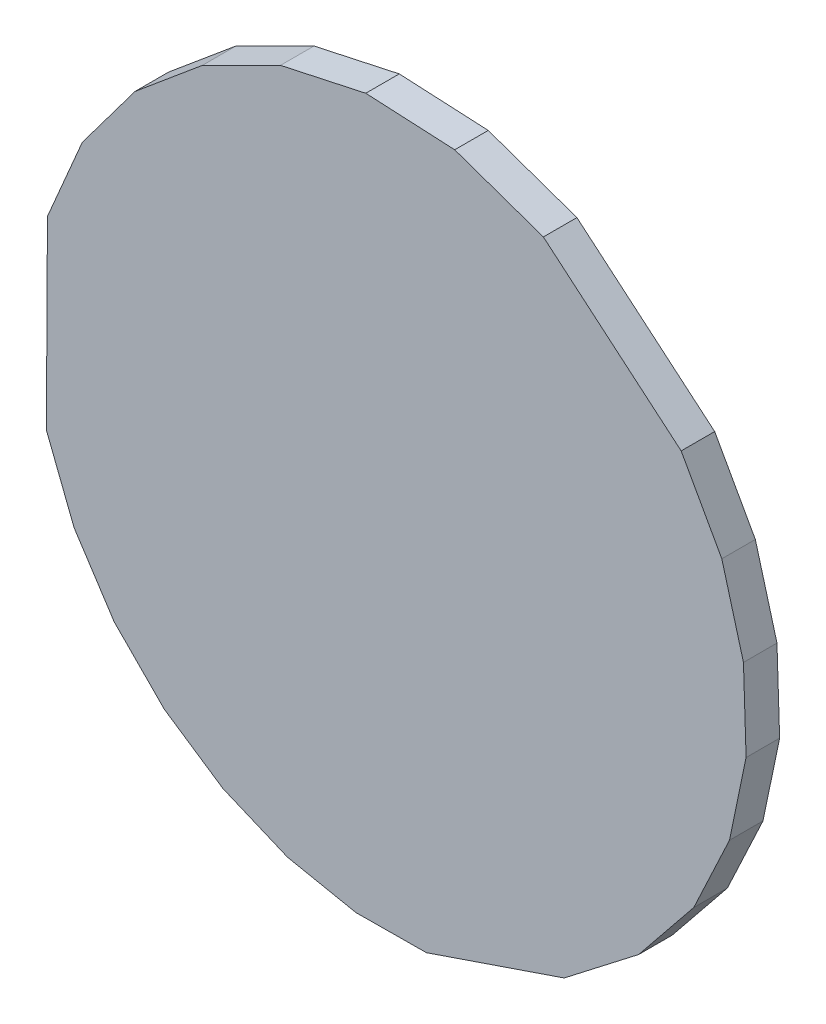
ISO-10303-21;
HEADER;
FILE_DESCRIPTION(('STEP AP214'),'2;1');
FILE_NAME('part.step','',(''),(''),'','','');
FILE_SCHEMA(('AUTOMOTIVE_DESIGN { 1 0 10303 214 1 1 1 1 }'));
ENDSEC;
DATA;
#1=APPLICATION_CONTEXT('core data for automotive mechanical design processes');
#2=APPLICATION_PROTOCOL_DEFINITION('international standard','automotive_design',2000,#1);
#3=PRODUCT_CONTEXT('',#1,'mechanical');
#4=PRODUCT('Part','Part','',(#3));
#5=PRODUCT_RELATED_PRODUCT_CATEGORY('part','',(#4));
#6=PRODUCT_DEFINITION_FORMATION('','',#4);
#7=PRODUCT_DEFINITION_CONTEXT('part definition',#1,'design');
#8=PRODUCT_DEFINITION('design','',#6,#7);
#9=PRODUCT_DEFINITION_SHAPE('','',#8);
#10=(LENGTH_UNIT() NAMED_UNIT(*) SI_UNIT(.MILLI.,.METRE.));
#11=(NAMED_UNIT(*) PLANE_ANGLE_UNIT() SI_UNIT($,.RADIAN.));
#12=(NAMED_UNIT(*) SI_UNIT($,.STERADIAN.) SOLID_ANGLE_UNIT());
#13=UNCERTAINTY_MEASURE_WITH_UNIT(LENGTH_MEASURE(1.E-05),#10,'distance_accuracy_value','');
#14=(GEOMETRIC_REPRESENTATION_CONTEXT(3) GLOBAL_UNCERTAINTY_ASSIGNED_CONTEXT((#13)) GLOBAL_UNIT_ASSIGNED_CONTEXT((#10,
#11,#12)) REPRESENTATION_CONTEXT('',''));
#15=CARTESIAN_POINT('',(0.,0.,0.));
#16=DIRECTION('',(0.,0.,1.));
#17=DIRECTION('',(1.,0.,0.));
#18=AXIS2_PLACEMENT_3D('',#15,#16,#17);
#19=CARTESIAN_POINT('',(15.81789159806,24.573864452691,0.));
#20=DIRECTION('',(0.,0.,1.));
#21=DIRECTION('',(1.,0.,0.));
#22=AXIS2_PLACEMENT_3D('',#19,#20,#21);
#23=PLANE('',#22);
#24=DIRECTION('',(0.763890180553774,-0.645346257487809,0.));
#25=VECTOR('',#24,1.);
#26=CARTESIAN_POINT('',(15.875699462891,24.696098632813,0.));
#27=LINE('',#26,#25);
#28=CARTESIAN_POINT('',(15.875699462891,24.696098632813,0.));
#29=VERTEX_POINT('',#28);
#30=CARTESIAN_POINT('',(15.927899169922,24.651999511719,0.));
#31=VERTEX_POINT('',#30);
#32=EDGE_CURVE('E374',#29,#31,#27,.T.);
#33=ORIENTED_EDGE('',*,*,#32,.T.);
#34=DIRECTION('',(0.485917606077819,-0.874004622472674,0.));
#35=VECTOR('',#34,1.);
#36=CARTESIAN_POINT('',(15.927899169922,24.651999511719,0.));
#37=LINE('',#36,#35);
#38=CARTESIAN_POINT('',(15.943299560547,24.624299316406,0.));
#39=VERTEX_POINT('',#38);
#40=EDGE_CURVE('E244',#31,#39,#37,.T.);
#41=ORIENTED_EDGE('',*,*,#40,.T.);
#42=DIRECTION('',(0.264503038887885,-0.96438485181958,0.));
#43=VECTOR('',#42,1.);
#44=CARTESIAN_POINT('',(15.943299560547,24.624299316406,0.));
#45=LINE('',#44,#43);
#46=CARTESIAN_POINT('',(15.951500244141,24.594399414063,0.));
#47=VERTEX_POINT('',#46);
#48=EDGE_CURVE('E345',#39,#47,#45,.T.);
#49=ORIENTED_EDGE('',*,*,#48,.T.);
#50=DIRECTION('',(0.0325473594104599,-0.99947019435069,0.));
#51=VECTOR('',#50,1.);
#52=CARTESIAN_POINT('',(15.951500244141,24.594399414062,0.));
#53=LINE('',#52,#51);
#54=CARTESIAN_POINT('',(15.9525,24.563698730469,0.));
#55=VERTEX_POINT('',#54);
#56=EDGE_CURVE('E278',#47,#55,#53,.T.);
#57=ORIENTED_EDGE('',*,*,#56,.T.);
#58=DIRECTION('',(-0.203566762067035,-0.979061067238169,0.));
#59=VECTOR('',#58,1.);
#60=CARTESIAN_POINT('',(15.9525,24.563698730469,0.));
#61=LINE('',#60,#59);
#62=CARTESIAN_POINT('',(15.946199951172,24.5333984375,0.));
#63=VERTEX_POINT('',#62);
#64=EDGE_CURVE('E277',#55,#63,#61,.T.);
#65=ORIENTED_EDGE('',*,*,#64,.T.);
#66=DIRECTION('',(-0.424441742682058,-0.905455248518124,0.));
#67=VECTOR('',#66,1.);
#68=CARTESIAN_POINT('',(15.946199951172,24.5333984375,0.));
#69=LINE('',#68,#67);
#70=CARTESIAN_POINT('',(15.932700195313,24.504599609375,0.));
#71=VERTEX_POINT('',#70);
#72=EDGE_CURVE('E317',#63,#71,#69,.T.);
#73=ORIENTED_EDGE('',*,*,#72,.T.);
#74=DIRECTION('',(-0.627990431803907,-0.778221059572885,0.));
#75=VECTOR('',#74,1.);
#76=CARTESIAN_POINT('',(15.932700195312,24.504599609375,0.));
#77=LINE('',#76,#75);
#78=CARTESIAN_POINT('',(15.911799316406,24.478698730469,0.));
#79=VERTEX_POINT('',#78);
#80=EDGE_CURVE('E297',#71,#79,#77,.T.);
#81=ORIENTED_EDGE('',*,*,#80,.T.);
#82=DIRECTION('',(-0.791165228647899,-0.611602469728922,0.));
#83=VECTOR('',#82,1.);
#84=CARTESIAN_POINT('',(15.911799316406,24.478698730469,0.));
#85=LINE('',#84,#83);
#86=CARTESIAN_POINT('',(15.883599853516,24.456899414062,0.));
#87=VERTEX_POINT('',#86);
#88=EDGE_CURVE('E331',#79,#87,#85,.T.);
#89=ORIENTED_EDGE('',*,*,#88,.T.);
#90=DIRECTION('',(-0.94648283768236,-0.322754144780123,0.));
#91=VECTOR('',#90,1.);
#92=CARTESIAN_POINT('',(15.883599853516,24.456899414063,0.));
#93=LINE('',#92,#91);
#94=CARTESIAN_POINT('',(15.831400146484,24.439099121094,0.));
#95=VERTEX_POINT('',#94);
#96=EDGE_CURVE('E246',#87,#95,#93,.T.);
#97=ORIENTED_EDGE('',*,*,#96,.T.);
#98=DIRECTION('',(-0.99997189246994,-0.00749761762744255,0.));
#99=VECTOR('',#98,1.);
#100=CARTESIAN_POINT('',(15.831400146484,24.439099121094,0.));
#101=LINE('',#100,#99);
#102=CARTESIAN_POINT('',(15.804699707031,24.438898925781,0.));
#103=VERTEX_POINT('',#102);
#104=EDGE_CURVE('E285',#95,#103,#101,.T.);
#105=ORIENTED_EDGE('',*,*,#104,.T.);
#106=DIRECTION('',(-0.980432882459363,0.196853658824073,0.));
#107=VECTOR('',#106,1.);
#108=CARTESIAN_POINT('',(15.804699707031,24.438898925781,0.));
#109=LINE('',#108,#107);
#110=CARTESIAN_POINT('',(15.778800048828,24.444099121094,0.));
#111=VERTEX_POINT('',#110);
#112=EDGE_CURVE('E303',#103,#111,#109,.T.);
#113=ORIENTED_EDGE('',*,*,#112,.T.);
#114=DIRECTION('',(-0.921847916612841,0.387551827032933,0.));
#115=VECTOR('',#114,1.);
#116=CARTESIAN_POINT('',(15.778800048828,24.444099121094,0.));
#117=LINE('',#116,#115);
#118=CARTESIAN_POINT('',(15.754299316406,24.454399414062,0.));
#119=VERTEX_POINT('',#118);
#120=EDGE_CURVE('E322',#111,#119,#117,.T.);
#121=ORIENTED_EDGE('',*,*,#120,.T.);
#122=DIRECTION('',(-0.830318315222741,0.557289417991826,0.));
#123=VECTOR('',#122,1.);
#124=CARTESIAN_POINT('',(15.754299316406,24.454399414063,0.));
#125=LINE('',#124,#123);
#126=CARTESIAN_POINT('',(15.732099609375,24.469299316406,0.));
#127=VERTEX_POINT('',#126);
#128=EDGE_CURVE('E312',#119,#127,#125,.T.);
#129=ORIENTED_EDGE('',*,*,#128,.T.);
#130=DIRECTION('',(-0.703414037872232,0.710780339714234,0.));
#131=VECTOR('',#130,1.);
#132=CARTESIAN_POINT('',(15.732099609375,24.469299316406,0.));
#133=LINE('',#132,#131);
#134=CARTESIAN_POINT('',(15.713099365234,24.488498535156,0.));
#135=VERTEX_POINT('',#134);
#136=EDGE_CURVE('E234',#127,#135,#133,.T.);
#137=ORIENTED_EDGE('',*,*,#136,.T.);
#138=DIRECTION('',(-0.546369499110154,0.837544249841236,0.));
#139=VECTOR('',#138,1.);
#140=CARTESIAN_POINT('',(15.713099365234,24.488498535156,0.));
#141=LINE('',#140,#139);
#142=CARTESIAN_POINT('',(15.697899169922,24.511799316406,0.));
#143=VERTEX_POINT('',#142);
#144=EDGE_CURVE('E214',#135,#143,#141,.T.);
#145=ORIENTED_EDGE('',*,*,#144,.T.);
#146=DIRECTION('',(-0.36477830722722,0.931094402612562,0.));
#147=VECTOR('',#146,1.);
#148=CARTESIAN_POINT('',(15.697899169922,24.511799316406,0.));
#149=LINE('',#148,#147);
#150=CARTESIAN_POINT('',(15.687399902344,24.538598632812,0.));
#151=VERTEX_POINT('',#150);
#152=EDGE_CURVE('E211',#143,#151,#149,.T.);
#153=ORIENTED_EDGE('',*,*,#152,.T.);
#154=DIRECTION('',(0.00567797757963115,0.999983880155378,0.));
#155=VECTOR('',#154,1.);
#156=CARTESIAN_POINT('',(15.687399902344,24.538598632812,0.));
#157=LINE('',#156,#155);
#158=CARTESIAN_POINT('',(15.687799072266,24.608898925781,0.));
#159=VERTEX_POINT('',#158);
#160=EDGE_CURVE('E198',#151,#159,#157,.T.);
#161=ORIENTED_EDGE('',*,*,#160,.T.);
#162=DIRECTION('',(0.392849239572112,0.919602889821261,0.));
#163=VECTOR('',#162,1.);
#164=CARTESIAN_POINT('',(15.687799072266,24.608898925781,0.));
#165=LINE('',#164,#163);
#166=CARTESIAN_POINT('',(15.700999755859,24.639799804688,0.));
#167=VERTEX_POINT('',#166);
#168=EDGE_CURVE('E308',#159,#167,#165,.T.);
#169=ORIENTED_EDGE('',*,*,#168,.T.);
#170=DIRECTION('',(0.599531513169224,0.800351150881299,0.));
#171=VECTOR('',#170,1.);
#172=CARTESIAN_POINT('',(15.700999755859,24.639799804688,0.));
#173=LINE('',#172,#171);
#174=CARTESIAN_POINT('',(15.720999755859,24.666499023437,0.));
#175=VERTEX_POINT('',#174);
#176=EDGE_CURVE('E380',#167,#175,#173,.T.);
#177=ORIENTED_EDGE('',*,*,#176,.T.);
#178=DIRECTION('',(0.767467909660063,0.641087363502053,0.));
#179=VECTOR('',#178,1.);
#180=CARTESIAN_POINT('',(15.720999755859,24.666499023437,0.));
#181=LINE('',#180,#179);
#182=CARTESIAN_POINT('',(15.746500244141,24.687800292969,0.));
#183=VERTEX_POINT('',#182);
#184=EDGE_CURVE('E290',#175,#183,#181,.T.);
#185=ORIENTED_EDGE('',*,*,#184,.T.);
#186=DIRECTION('',(0.894427190999916,0.447213595499958,0.));
#187=VECTOR('',#186,1.);
#188=CARTESIAN_POINT('',(15.746500244141,24.687800292969,0.));
#189=LINE('',#188,#187);
#190=CARTESIAN_POINT('',(15.776099853516,24.702600097656,0.));
#191=VERTEX_POINT('',#190);
#192=EDGE_CURVE('E289',#183,#191,#189,.T.);
#193=ORIENTED_EDGE('',*,*,#192,.T.);
#194=DIRECTION('',(0.977315495518052,0.211788626277012,0.));
#195=VECTOR('',#194,1.);
#196=CARTESIAN_POINT('',(15.776099853516,24.702600097656,0.));
#197=LINE('',#196,#195);
#198=CARTESIAN_POINT('',(15.808399658203,24.709599609375,0.));
#199=VERTEX_POINT('',#198);
#200=EDGE_CURVE('E268',#191,#199,#197,.T.);
#201=ORIENTED_EDGE('',*,*,#200,.T.);
#202=DIRECTION('',(0.998731229996615,-0.0503580205076506,0.));
#203=VECTOR('',#202,1.);
#204=CARTESIAN_POINT('',(15.808399658203,24.709599609375,0.));
#205=LINE('',#204,#203);
#206=CARTESIAN_POINT('',(15.842099609375,24.707900390625,0.));
#207=VERTEX_POINT('',#206);
#208=EDGE_CURVE('E28',#199,#207,#205,.T.);
#209=ORIENTED_EDGE('',*,*,#208,.T.);
#210=DIRECTION('',(0.943491716253028,-0.331396109455009,0.));
#211=VECTOR('',#210,1.);
#212=CARTESIAN_POINT('',(15.842099609375,24.707900390625,0.));
#213=LINE('',#212,#211);
#214=EDGE_CURVE('E11',#207,#29,#213,.T.);
#215=ORIENTED_EDGE('',*,*,#214,.T.);
#216=EDGE_LOOP('',(#33,#41,#49,#57,#65,#73,#81,#89,#97,#105,#113,#121,#129,#137,#145,#153,#161,
#169,#177,#185,#193,#201,#209,#215));
#217=FACE_BOUND('',#216,.T.);
#218=ADVANCED_FACE('F17',(#217),#23,.F.);
#219=CARTESIAN_POINT('',(15.842099609375,24.707900390625,0.));
#220=DIRECTION('',(-0.331396109455009,-0.943491716253028,0.));
#221=DIRECTION('',(-0.943491716253028,0.331396109455009,0.));
#222=AXIS2_PLACEMENT_3D('',#219,#220,#221);
#223=PLANE('',#222);
#224=DIRECTION('',(0.,0.,-1.));
#225=VECTOR('',#224,1.);
#226=CARTESIAN_POINT('',(15.875699462891,24.696098632813,0.));
#227=LINE('',#226,#225);
#228=CARTESIAN_POINT('',(15.875699462891,24.696098632813,0.0127));
#229=VERTEX_POINT('',#228);
#230=EDGE_CURVE('E245',#229,#29,#227,.T.);
#231=ORIENTED_EDGE('',*,*,#230,.T.);
#232=ORIENTED_EDGE('',*,*,#214,.F.);
#233=DIRECTION('',(0.,0.,1.));
#234=VECTOR('',#233,1.);
#235=CARTESIAN_POINT('',(15.842099609375,24.707900390625,0.));
#236=LINE('',#235,#234);
#237=CARTESIAN_POINT('',(15.842099609375,24.707900390625,0.0127));
#238=VERTEX_POINT('',#237);
#239=EDGE_CURVE('E272',#207,#238,#236,.T.);
#240=ORIENTED_EDGE('',*,*,#239,.T.);
#241=DIRECTION('',(-0.943491716253028,0.331396109455009,0.));
#242=VECTOR('',#241,1.);
#243=CARTESIAN_POINT('',(15.875699462891,24.696098632813,0.0127));
#244=LINE('',#243,#242);
#245=EDGE_CURVE('E256',#229,#238,#244,.T.);
#246=ORIENTED_EDGE('',*,*,#245,.F.);
#247=EDGE_LOOP('',(#231,#232,#240,#246));
#248=FACE_BOUND('',#247,.T.);
#249=ADVANCED_FACE('F739',(#248),#223,.F.);
#250=CARTESIAN_POINT('',(15.808399658203,24.709599609375,0.));
#251=DIRECTION('',(-0.0503580205076506,-0.998731229996615,0.));
#252=DIRECTION('',(-0.998731229996615,0.0503580205076506,0.));
#253=AXIS2_PLACEMENT_3D('',#250,#251,#252);
#254=PLANE('',#253);
#255=ORIENTED_EDGE('',*,*,#239,.F.);
#256=ORIENTED_EDGE('',*,*,#208,.F.);
#257=DIRECTION('',(0.,0.,1.));
#258=VECTOR('',#257,1.);
#259=CARTESIAN_POINT('',(15.808399658203,24.709599609375,0.));
#260=LINE('',#259,#258);
#261=CARTESIAN_POINT('',(15.808399658203,24.709599609375,0.0127));
#262=VERTEX_POINT('',#261);
#263=EDGE_CURVE('E273',#199,#262,#260,.T.);
#264=ORIENTED_EDGE('',*,*,#263,.T.);
#265=DIRECTION('',(-0.998731229996614,0.0503580205076606,0.));
#266=VECTOR('',#265,1.);
#267=CARTESIAN_POINT('',(15.842099609375,24.707900390625,0.0127));
#268=LINE('',#267,#266);
#269=EDGE_CURVE('E324',#238,#262,#268,.T.);
#270=ORIENTED_EDGE('',*,*,#269,.F.);
#271=EDGE_LOOP('',(#255,#256,#264,#270));
#272=FACE_BOUND('',#271,.T.);
#273=ADVANCED_FACE('F733',(#272),#254,.F.);
#274=CARTESIAN_POINT('',(15.776099853516,24.702600097656,0.));
#275=DIRECTION('',(0.211788626277012,-0.977315495518052,0.));
#276=DIRECTION('',(0.,0.,-1.));
#277=AXIS2_PLACEMENT_3D('',#274,#275,#276);
#278=PLANE('',#277);
#279=ORIENTED_EDGE('',*,*,#263,.F.);
#280=ORIENTED_EDGE('',*,*,#200,.F.);
#281=DIRECTION('',(0.,0.,1.));
#282=VECTOR('',#281,1.);
#283=CARTESIAN_POINT('',(15.776099853516,24.702600097656,0.));
#284=LINE('',#283,#282);
#285=CARTESIAN_POINT('',(15.776099853516,24.702600097656,0.0127));
#286=VERTEX_POINT('',#285);
#287=EDGE_CURVE('E286',#191,#286,#284,.T.);
#288=ORIENTED_EDGE('',*,*,#287,.T.);
#289=DIRECTION('',(-0.977315495518259,-0.211788626276056,0.));
#290=VECTOR('',#289,1.);
#291=CARTESIAN_POINT('',(15.808399658203,24.709599609375,0.0127));
#292=LINE('',#291,#290);
#293=EDGE_CURVE('E327',#262,#286,#292,.T.);
#294=ORIENTED_EDGE('',*,*,#293,.F.);
#295=EDGE_LOOP('',(#279,#280,#288,#294));
#296=FACE_BOUND('',#295,.T.);
#297=ADVANCED_FACE('F738',(#296),#278,.F.);
#298=CARTESIAN_POINT('',(15.746500244141,24.687800292969,0.));
#299=DIRECTION('',(0.447213595499958,-0.894427190999916,0.));
#300=DIRECTION('',(0.,0.,-1.));
#301=AXIS2_PLACEMENT_3D('',#298,#299,#300);
#302=PLANE('',#301);
#303=ORIENTED_EDGE('',*,*,#287,.F.);
#304=ORIENTED_EDGE('',*,*,#192,.F.);
#305=DIRECTION('',(0.,0.,1.));
#306=VECTOR('',#305,1.);
#307=CARTESIAN_POINT('',(15.746500244141,24.687800292969,0.));
#308=LINE('',#307,#306);
#309=CARTESIAN_POINT('',(15.746500244141,24.687800292969,0.0127));
#310=VERTEX_POINT('',#309);
#311=EDGE_CURVE('E238',#183,#310,#308,.T.);
#312=ORIENTED_EDGE('',*,*,#311,.T.);
#313=DIRECTION('',(-0.894427190998916,-0.447213595501958,0.));
#314=VECTOR('',#313,1.);
#315=CARTESIAN_POINT('',(15.776099853516,24.702600097656,0.0127));
#316=LINE('',#315,#314);
#317=EDGE_CURVE('E423',#286,#310,#316,.T.);
#318=ORIENTED_EDGE('',*,*,#317,.F.);
#319=EDGE_LOOP('',(#303,#304,#312,#318));
#320=FACE_BOUND('',#319,.T.);
#321=ADVANCED_FACE('F580',(#320),#302,.F.);
#322=CARTESIAN_POINT('',(15.720999755859,24.666499023437,0.));
#323=DIRECTION('',(0.641087363502053,-0.767467909660063,0.));
#324=DIRECTION('',(0.,0.,-1.));
#325=AXIS2_PLACEMENT_3D('',#322,#323,#324);
#326=PLANE('',#325);
#327=ORIENTED_EDGE('',*,*,#311,.F.);
#328=ORIENTED_EDGE('',*,*,#184,.F.);
#329=DIRECTION('',(0.,0.,1.));
#330=VECTOR('',#329,1.);
#331=CARTESIAN_POINT('',(15.720999755859,24.666499023437,0.));
#332=LINE('',#331,#330);
#333=CARTESIAN_POINT('',(15.720999755859,24.666499023437,0.0127));
#334=VERTEX_POINT('',#333);
#335=EDGE_CURVE('E311',#175,#334,#332,.T.);
#336=ORIENTED_EDGE('',*,*,#335,.T.);
#337=DIRECTION('',(-0.767467909660063,-0.641087363502053,0.));
#338=VECTOR('',#337,1.);
#339=CARTESIAN_POINT('',(15.746500244141,24.687800292969,0.0127));
#340=LINE('',#339,#338);
#341=EDGE_CURVE('E385',#310,#334,#340,.T.);
#342=ORIENTED_EDGE('',*,*,#341,.F.);
#343=EDGE_LOOP('',(#327,#328,#336,#342));
#344=FACE_BOUND('',#343,.T.);
#345=ADVANCED_FACE('F570',(#344),#326,.F.);
#346=CARTESIAN_POINT('',(15.700999755859,24.639799804688,0.));
#347=DIRECTION('',(0.800351150881299,-0.599531513169224,0.));
#348=DIRECTION('',(0.,0.,-1.));
#349=AXIS2_PLACEMENT_3D('',#346,#347,#348);
#350=PLANE('',#349);
#351=ORIENTED_EDGE('',*,*,#335,.F.);
#352=ORIENTED_EDGE('',*,*,#176,.F.);
#353=DIRECTION('',(0.,0.,1.));
#354=VECTOR('',#353,1.);
#355=CARTESIAN_POINT('',(15.700999755859,24.639799804688,0.));
#356=LINE('',#355,#354);
#357=CARTESIAN_POINT('',(15.700999755859,24.639799804688,0.0127));
#358=VERTEX_POINT('',#357);
#359=EDGE_CURVE('E208',#167,#358,#356,.T.);
#360=ORIENTED_EDGE('',*,*,#359,.T.);
#361=DIRECTION('',(-0.599531513169224,-0.800351150881299,0.));
#362=VECTOR('',#361,1.);
#363=CARTESIAN_POINT('',(15.720999755859,24.666499023437,0.0127));
#364=LINE('',#363,#362);
#365=EDGE_CURVE('E381',#334,#358,#364,.T.);
#366=ORIENTED_EDGE('',*,*,#365,.F.);
#367=EDGE_LOOP('',(#351,#352,#360,#366));
#368=FACE_BOUND('',#367,.T.);
#369=ADVANCED_FACE('F19',(#368),#350,.F.);
#370=CARTESIAN_POINT('',(15.687799072266,24.608898925781,0.));
#371=DIRECTION('',(0.919602889821261,-0.392849239572112,0.));
#372=DIRECTION('',(0.,0.,-1.));
#373=AXIS2_PLACEMENT_3D('',#370,#371,#372);
#374=PLANE('',#373);
#375=ORIENTED_EDGE('',*,*,#359,.F.);
#376=ORIENTED_EDGE('',*,*,#168,.F.);
#377=DIRECTION('',(0.,0.,1.));
#378=VECTOR('',#377,1.);
#379=CARTESIAN_POINT('',(15.687799072266,24.608898925781,0.));
#380=LINE('',#379,#378);
#381=CARTESIAN_POINT('',(15.687799072266,24.608898925781,0.0127));
#382=VERTEX_POINT('',#381);
#383=EDGE_CURVE('E204',#159,#382,#380,.T.);
#384=ORIENTED_EDGE('',*,*,#383,.T.);
#385=DIRECTION('',(-0.392849239573803,-0.919602889820538,0.));
#386=VECTOR('',#385,1.);
#387=CARTESIAN_POINT('',(15.700999755859,24.639799804688,0.0127));
#388=LINE('',#387,#386);
#389=EDGE_CURVE('E370',#358,#382,#388,.T.);
#390=ORIENTED_EDGE('',*,*,#389,.F.);
#391=EDGE_LOOP('',(#375,#376,#384,#390));
#392=FACE_BOUND('',#391,.T.);
#393=ADVANCED_FACE('F564',(#392),#374,.F.);
#394=CARTESIAN_POINT('',(15.687399902344,24.538598632812,0.));
#395=DIRECTION('',(0.999983880155378,-0.00567797757963115,0.));
#396=DIRECTION('',(0.,0.,-1.));
#397=AXIS2_PLACEMENT_3D('',#394,#395,#396);
#398=PLANE('',#397);
#399=ORIENTED_EDGE('',*,*,#383,.F.);
#400=ORIENTED_EDGE('',*,*,#160,.F.);
#401=DIRECTION('',(0.,0.,1.));
#402=VECTOR('',#401,1.);
#403=CARTESIAN_POINT('',(15.687399902344,24.538598632812,0.));
#404=LINE('',#403,#402);
#405=CARTESIAN_POINT('',(15.687399902344,24.538598632812,0.0127));
#406=VERTEX_POINT('',#405);
#407=EDGE_CURVE('E21',#151,#406,#404,.T.);
#408=ORIENTED_EDGE('',*,*,#407,.T.);
#409=DIRECTION('',(-0.00567797757851718,-0.999983880155384,0.));
#410=VECTOR('',#409,1.);
#411=CARTESIAN_POINT('',(15.687799072266,24.608898925781,0.0127));
#412=LINE('',#411,#410);
#413=EDGE_CURVE('E261',#382,#406,#412,.T.);
#414=ORIENTED_EDGE('',*,*,#413,.F.);
#415=EDGE_LOOP('',(#399,#400,#408,#414));
#416=FACE_BOUND('',#415,.T.);
#417=ADVANCED_FACE('F200',(#416),#398,.F.);
#418=CARTESIAN_POINT('',(15.697899169922,24.511799316406,0.));
#419=DIRECTION('',(0.931094402612562,0.36477830722722,0.));
#420=DIRECTION('',(0.,0.,-1.));
#421=AXIS2_PLACEMENT_3D('',#418,#419,#420);
#422=PLANE('',#421);
#423=ORIENTED_EDGE('',*,*,#407,.F.);
#424=ORIENTED_EDGE('',*,*,#152,.F.);
#425=DIRECTION('',(0.,0.,1.));
#426=VECTOR('',#425,1.);
#427=CARTESIAN_POINT('',(15.697899169922,24.511799316406,0.));
#428=LINE('',#427,#426);
#429=CARTESIAN_POINT('',(15.697899169922,24.511799316406,0.0127));
#430=VERTEX_POINT('',#429);
#431=EDGE_CURVE('E229',#143,#430,#428,.T.);
#432=ORIENTED_EDGE('',*,*,#431,.T.);
#433=DIRECTION('',(0.364778307226881,-0.931094402612695,0.));
#434=VECTOR('',#433,1.);
#435=CARTESIAN_POINT('',(15.687399902344,24.538598632812,0.0127));
#436=LINE('',#435,#434);
#437=EDGE_CURVE('E222',#406,#430,#436,.T.);
#438=ORIENTED_EDGE('',*,*,#437,.F.);
#439=EDGE_LOOP('',(#423,#424,#432,#438));
#440=FACE_BOUND('',#439,.T.);
#441=ADVANCED_FACE('F220',(#440),#422,.F.);
#442=CARTESIAN_POINT('',(15.713099365234,24.488498535156,0.));
#443=DIRECTION('',(0.837544249841236,0.546369499110154,0.));
#444=DIRECTION('',(0.,0.,-1.));
#445=AXIS2_PLACEMENT_3D('',#442,#443,#444);
#446=PLANE('',#445);
#447=ORIENTED_EDGE('',*,*,#431,.F.);
#448=ORIENTED_EDGE('',*,*,#144,.F.);
#449=DIRECTION('',(0.,0.,1.));
#450=VECTOR('',#449,1.);
#451=CARTESIAN_POINT('',(15.713099365234,24.488498535156,0.));
#452=LINE('',#451,#450);
#453=CARTESIAN_POINT('',(15.713099365234,24.488498535156,0.0127));
#454=VERTEX_POINT('',#453);
#455=EDGE_CURVE('E316',#135,#454,#452,.T.);
#456=ORIENTED_EDGE('',*,*,#455,.T.);
#457=DIRECTION('',(0.546369499108995,-0.837544249841993,0.));
#458=VECTOR('',#457,1.);
#459=CARTESIAN_POINT('',(15.697899169922,24.511799316406,0.0127));
#460=LINE('',#459,#458);
#461=EDGE_CURVE('E260',#430,#454,#460,.T.);
#462=ORIENTED_EDGE('',*,*,#461,.F.);
#463=EDGE_LOOP('',(#447,#448,#456,#462));
#464=FACE_BOUND('',#463,.T.);
#465=ADVANCED_FACE('F558',(#464),#446,.F.);
#466=CARTESIAN_POINT('',(15.732099609375,24.469299316406,0.));
#467=DIRECTION('',(0.710780339714234,0.703414037872232,0.));
#468=DIRECTION('',(0.,0.,-1.));
#469=AXIS2_PLACEMENT_3D('',#466,#467,#468);
#470=PLANE('',#469);
#471=ORIENTED_EDGE('',*,*,#455,.F.);
#472=ORIENTED_EDGE('',*,*,#136,.F.);
#473=DIRECTION('',(0.,0.,1.));
#474=VECTOR('',#473,1.);
#475=CARTESIAN_POINT('',(15.732099609375,24.469299316406,0.));
#476=LINE('',#475,#474);
#477=CARTESIAN_POINT('',(15.732099609375,24.469299316406,0.0127));
#478=VERTEX_POINT('',#477);
#479=EDGE_CURVE('E124',#127,#478,#476,.T.);
#480=ORIENTED_EDGE('',*,*,#479,.T.);
#481=DIRECTION('',(0.703414037871732,-0.710780339714729,0.));
#482=VECTOR('',#481,1.);
#483=CARTESIAN_POINT('',(15.713099365234,24.488498535156,0.0127));
#484=LINE('',#483,#482);
#485=EDGE_CURVE('E363',#454,#478,#484,.T.);
#486=ORIENTED_EDGE('',*,*,#485,.F.);
#487=EDGE_LOOP('',(#471,#472,#480,#486));
#488=FACE_BOUND('',#487,.T.);
#489=ADVANCED_FACE('F690',(#488),#470,.F.);
#490=CARTESIAN_POINT('',(15.754299316406,24.454399414063,0.));
#491=DIRECTION('',(0.557289417991826,0.830318315222741,0.));
#492=DIRECTION('',(0.,0.,-1.));
#493=AXIS2_PLACEMENT_3D('',#490,#491,#492);
#494=PLANE('',#493);
#495=ORIENTED_EDGE('',*,*,#479,.F.);
#496=ORIENTED_EDGE('',*,*,#128,.F.);
#497=DIRECTION('',(0.,0.,1.));
#498=VECTOR('',#497,1.);
#499=CARTESIAN_POINT('',(15.754299316406,24.454399414062,0.));
#500=LINE('',#499,#498);
#501=CARTESIAN_POINT('',(15.754299316406,24.454399414062,0.0127));
#502=VERTEX_POINT('',#501);
#503=EDGE_CURVE('E111',#119,#502,#500,.T.);
#504=ORIENTED_EDGE('',*,*,#503,.T.);
#505=DIRECTION('',(0.830318315223977,-0.557289417989985,0.));
#506=VECTOR('',#505,1.);
#507=CARTESIAN_POINT('',(15.732099609375,24.469299316406,0.0127));
#508=LINE('',#507,#506);
#509=EDGE_CURVE('E367',#478,#502,#508,.T.);
#510=ORIENTED_EDGE('',*,*,#509,.F.);
#511=EDGE_LOOP('',(#495,#496,#504,#510));
#512=FACE_BOUND('',#511,.T.);
#513=ADVANCED_FACE('F684',(#512),#494,.F.);
#514=CARTESIAN_POINT('',(15.778800048828,24.444099121094,0.));
#515=DIRECTION('',(0.387551827032933,0.921847916612841,0.));
#516=DIRECTION('',(0.,0.,-1.));
#517=AXIS2_PLACEMENT_3D('',#514,#515,#516);
#518=PLANE('',#517);
#519=ORIENTED_EDGE('',*,*,#503,.F.);
#520=ORIENTED_EDGE('',*,*,#120,.F.);
#521=DIRECTION('',(0.,0.,1.));
#522=VECTOR('',#521,1.);
#523=CARTESIAN_POINT('',(15.778800048828,24.444099121094,0.));
#524=LINE('',#523,#522);
#525=CARTESIAN_POINT('',(15.778800048828,24.444099121094,0.0127));
#526=VERTEX_POINT('',#525);
#527=EDGE_CURVE('E307',#111,#526,#524,.T.);
#528=ORIENTED_EDGE('',*,*,#527,.T.);
#529=DIRECTION('',(0.921847916611619,-0.38755182703584,0.));
#530=VECTOR('',#529,1.);
#531=CARTESIAN_POINT('',(15.754299316406,24.454399414063,0.0127));
#532=LINE('',#531,#530);
#533=EDGE_CURVE('E389',#502,#526,#532,.T.);
#534=ORIENTED_EDGE('',*,*,#533,.F.);
#535=EDGE_LOOP('',(#519,#520,#528,#534));
#536=FACE_BOUND('',#535,.T.);
#537=ADVANCED_FACE('F689',(#536),#518,.F.);
#538=CARTESIAN_POINT('',(15.804699707031,24.438898925781,0.));
#539=DIRECTION('',(0.196853658824073,0.980432882459363,0.));
#540=DIRECTION('',(0.,0.,-1.));
#541=AXIS2_PLACEMENT_3D('',#538,#539,#540);
#542=PLANE('',#541);
#543=ORIENTED_EDGE('',*,*,#527,.F.);
#544=ORIENTED_EDGE('',*,*,#112,.F.);
#545=DIRECTION('',(0.,0.,1.));
#546=VECTOR('',#545,1.);
#547=CARTESIAN_POINT('',(15.804699707031,24.438898925781,0.));
#548=LINE('',#547,#546);
#549=CARTESIAN_POINT('',(15.804699707031,24.438898925781,0.0127));
#550=VERTEX_POINT('',#549);
#551=EDGE_CURVE('E250',#103,#550,#548,.T.);
#552=ORIENTED_EDGE('',*,*,#551,.T.);
#553=DIRECTION('',(0.980432882459363,-0.196853658824073,0.));
#554=VECTOR('',#553,1.);
#555=CARTESIAN_POINT('',(15.778800048828,24.444099121094,0.0127));
#556=LINE('',#555,#554);
#557=EDGE_CURVE('E267',#526,#550,#556,.T.);
#558=ORIENTED_EDGE('',*,*,#557,.F.);
#559=EDGE_LOOP('',(#543,#544,#552,#558));
#560=FACE_BOUND('',#559,.T.);
#561=ADVANCED_FACE('F541',(#560),#542,.F.);
#562=CARTESIAN_POINT('',(15.831400146484,24.439099121094,0.));
#563=DIRECTION('',(-0.00749761762744255,0.99997189246994,0.));
#564=DIRECTION('',(0.,0.,1.));
#565=AXIS2_PLACEMENT_3D('',#562,#563,#564);
#566=PLANE('',#565);
#567=ORIENTED_EDGE('',*,*,#551,.F.);
#568=ORIENTED_EDGE('',*,*,#104,.F.);
#569=DIRECTION('',(0.,0.,1.));
#570=VECTOR('',#569,1.);
#571=CARTESIAN_POINT('',(15.831400146484,24.439099121094,0.));
#572=LINE('',#571,#570);
#573=CARTESIAN_POINT('',(15.831400146484,24.439099121094,0.0127));
#574=VERTEX_POINT('',#573);
#575=EDGE_CURVE('E251',#95,#574,#572,.T.);
#576=ORIENTED_EDGE('',*,*,#575,.T.);
#577=DIRECTION('',(0.999971892469911,0.00749761763125833,0.));
#578=VECTOR('',#577,1.);
#579=CARTESIAN_POINT('',(15.804699707031,24.438898925781,0.0127));
#580=LINE('',#579,#578);
#581=EDGE_CURVE('E262',#550,#574,#580,.T.);
#582=ORIENTED_EDGE('',*,*,#581,.F.);
#583=EDGE_LOOP('',(#567,#568,#576,#582));
#584=FACE_BOUND('',#583,.T.);
#585=ADVANCED_FACE('F545',(#584),#566,.F.);
#586=CARTESIAN_POINT('',(15.883599853516,24.456899414063,0.));
#587=DIRECTION('',(-0.322754144780123,0.94648283768236,0.));
#588=DIRECTION('',(0.,0.,1.));
#589=AXIS2_PLACEMENT_3D('',#586,#587,#588);
#590=PLANE('',#589);
#591=ORIENTED_EDGE('',*,*,#575,.F.);
#592=ORIENTED_EDGE('',*,*,#96,.F.);
#593=DIRECTION('',(0.,0.,1.));
#594=VECTOR('',#593,1.);
#595=CARTESIAN_POINT('',(15.883599853516,24.456899414062,0.));
#596=LINE('',#595,#594);
#597=CARTESIAN_POINT('',(15.883599853516,24.456899414062,0.0127));
#598=VERTEX_POINT('',#597);
#599=EDGE_CURVE('E301',#87,#598,#596,.T.);
#600=ORIENTED_EDGE('',*,*,#599,.T.);
#601=DIRECTION('',(0.946482837682464,0.322754144779817,0.));
#602=VECTOR('',#601,1.);
#603=CARTESIAN_POINT('',(15.831400146484,24.439099121094,0.0127));
#604=LINE('',#603,#602);
#605=EDGE_CURVE('E266',#574,#598,#604,.T.);
#606=ORIENTED_EDGE('',*,*,#605,.F.);
#607=EDGE_LOOP('',(#591,#592,#600,#606));
#608=FACE_BOUND('',#607,.T.);
#609=ADVANCED_FACE('F549',(#608),#590,.F.);
#610=CARTESIAN_POINT('',(15.911799316406,24.478698730469,0.));
#611=DIRECTION('',(-0.611602469728922,0.791165228647899,0.));
#612=DIRECTION('',(0.,0.,1.));
#613=AXIS2_PLACEMENT_3D('',#610,#611,#612);
#614=PLANE('',#613);
#615=ORIENTED_EDGE('',*,*,#599,.F.);
#616=ORIENTED_EDGE('',*,*,#88,.F.);
#617=DIRECTION('',(0.,0.,1.));
#618=VECTOR('',#617,1.);
#619=CARTESIAN_POINT('',(15.911799316406,24.478698730469,0.));
#620=LINE('',#619,#618);
#621=CARTESIAN_POINT('',(15.911799316406,24.478698730469,0.0127));
#622=VERTEX_POINT('',#621);
#623=EDGE_CURVE('E302',#79,#622,#620,.T.);
#624=ORIENTED_EDGE('',*,*,#623,.T.);
#625=DIRECTION('',(0.791165228648383,0.611602469728296,0.));
#626=VECTOR('',#625,1.);
#627=CARTESIAN_POINT('',(15.883599853516,24.456899414063,0.0127));
#628=LINE('',#627,#626);
#629=EDGE_CURVE('E430',#598,#622,#628,.T.);
#630=ORIENTED_EDGE('',*,*,#629,.F.);
#631=EDGE_LOOP('',(#615,#616,#624,#630));
#632=FACE_BOUND('',#631,.T.);
#633=ADVANCED_FACE('F513',(#632),#614,.F.);
#634=CARTESIAN_POINT('',(15.932700195312,24.504599609375,0.));
#635=DIRECTION('',(-0.778221059572885,0.627990431803907,0.));
#636=DIRECTION('',(0.,0.,1.));
#637=AXIS2_PLACEMENT_3D('',#634,#635,#636);
#638=PLANE('',#637);
#639=ORIENTED_EDGE('',*,*,#623,.F.);
#640=ORIENTED_EDGE('',*,*,#80,.F.);
#641=DIRECTION('',(0.,0.,1.));
#642=VECTOR('',#641,1.);
#643=CARTESIAN_POINT('',(15.932700195313,24.504599609375,0.));
#644=LINE('',#643,#642);
#645=CARTESIAN_POINT('',(15.932700195313,24.504599609375,0.0127));
#646=VERTEX_POINT('',#645);
#647=EDGE_CURVE('E282',#71,#646,#644,.T.);
#648=ORIENTED_EDGE('',*,*,#647,.T.);
#649=DIRECTION('',(0.627990431803301,0.778221059573373,0.));
#650=VECTOR('',#649,1.);
#651=CARTESIAN_POINT('',(15.911799316406,24.478698730469,0.0127));
#652=LINE('',#651,#650);
#653=EDGE_CURVE('E427',#622,#646,#652,.T.);
#654=ORIENTED_EDGE('',*,*,#653,.F.);
#655=EDGE_LOOP('',(#639,#640,#648,#654));
#656=FACE_BOUND('',#655,.T.);
#657=ADVANCED_FACE('F510',(#656),#638,.F.);
#658=CARTESIAN_POINT('',(15.946199951172,24.5333984375,0.));
#659=DIRECTION('',(-0.905455248518124,0.424441742682058,0.));
#660=DIRECTION('',(0.,0.,1.));
#661=AXIS2_PLACEMENT_3D('',#658,#659,#660);
#662=PLANE('',#661);
#663=ORIENTED_EDGE('',*,*,#647,.F.);
#664=ORIENTED_EDGE('',*,*,#72,.F.);
#665=DIRECTION('',(0.,0.,1.));
#666=VECTOR('',#665,1.);
#667=CARTESIAN_POINT('',(15.946199951172,24.5333984375,0.));
#668=LINE('',#667,#666);
#669=CARTESIAN_POINT('',(15.946199951172,24.5333984375,0.0127));
#670=VERTEX_POINT('',#669);
#671=EDGE_CURVE('E274',#63,#670,#668,.T.);
#672=ORIENTED_EDGE('',*,*,#671,.T.);
#673=DIRECTION('',(0.424441742682878,0.90545524851774,0.));
#674=VECTOR('',#673,1.);
#675=CARTESIAN_POINT('',(15.932700195312,24.504599609375,0.0127));
#676=LINE('',#675,#674);
#677=EDGE_CURVE('E415',#646,#670,#676,.T.);
#678=ORIENTED_EDGE('',*,*,#677,.F.);
#679=EDGE_LOOP('',(#663,#664,#672,#678));
#680=FACE_BOUND('',#679,.T.);
#681=ADVANCED_FACE('F469',(#680),#662,.F.);
#682=CARTESIAN_POINT('',(15.9525,24.563698730469,0.));
#683=DIRECTION('',(-0.979061067238169,0.203566762067035,0.));
#684=DIRECTION('',(0.,0.,1.));
#685=AXIS2_PLACEMENT_3D('',#682,#683,#684);
#686=PLANE('',#685);
#687=ORIENTED_EDGE('',*,*,#671,.F.);
#688=ORIENTED_EDGE('',*,*,#64,.F.);
#689=DIRECTION('',(0.,0.,1.));
#690=VECTOR('',#689,1.);
#691=CARTESIAN_POINT('',(15.9525,24.563698730469,0.));
#692=LINE('',#691,#690);
#693=CARTESIAN_POINT('',(15.9525,24.563698730469,0.0127));
#694=VERTEX_POINT('',#693);
#695=EDGE_CURVE('E349',#55,#694,#692,.T.);
#696=ORIENTED_EDGE('',*,*,#695,.T.);
#697=DIRECTION('',(0.203566762066077,0.979061067238368,0.));
#698=VECTOR('',#697,1.);
#699=CARTESIAN_POINT('',(15.946199951172,24.5333984375,0.0127));
#700=LINE('',#699,#698);
#701=EDGE_CURVE('E399',#670,#694,#700,.T.);
#702=ORIENTED_EDGE('',*,*,#701,.F.);
#703=EDGE_LOOP('',(#687,#688,#696,#702));
#704=FACE_BOUND('',#703,.T.);
#705=ADVANCED_FACE('F455',(#704),#686,.F.);
#706=CARTESIAN_POINT('',(15.951500244141,24.594399414062,0.));
#707=DIRECTION('',(-0.99947019435069,-0.0325473594104599,0.));
#708=DIRECTION('',(-0.0325473594104599,0.99947019435069,0.));
#709=AXIS2_PLACEMENT_3D('',#706,#707,#708);
#710=PLANE('',#709);
#711=ORIENTED_EDGE('',*,*,#695,.F.);
#712=ORIENTED_EDGE('',*,*,#56,.F.);
#713=DIRECTION('',(0.,0.,1.));
#714=VECTOR('',#713,1.);
#715=CARTESIAN_POINT('',(15.951500244141,24.594399414063,0.));
#716=LINE('',#715,#714);
#717=CARTESIAN_POINT('',(15.951500244141,24.594399414063,0.0127));
#718=VERTEX_POINT('',#717);
#719=EDGE_CURVE('E350',#47,#718,#716,.T.);
#720=ORIENTED_EDGE('',*,*,#719,.T.);
#721=DIRECTION('',(-0.032547359411349,0.999470194350661,0.));
#722=VECTOR('',#721,1.);
#723=CARTESIAN_POINT('',(15.9525,24.563698730469,0.0127));
#724=LINE('',#723,#722);
#725=EDGE_CURVE('E296',#694,#718,#724,.T.);
#726=ORIENTED_EDGE('',*,*,#725,.F.);
#727=EDGE_LOOP('',(#711,#712,#720,#726));
#728=FACE_BOUND('',#727,.T.);
#729=ADVANCED_FACE('F459',(#728),#710,.F.);
#730=CARTESIAN_POINT('',(15.943299560547,24.624299316406,0.));
#731=DIRECTION('',(-0.96438485181958,-0.264503038887885,0.));
#732=DIRECTION('',(-0.264503038887885,0.96438485181958,0.));
#733=AXIS2_PLACEMENT_3D('',#730,#731,#732);
#734=PLANE('',#733);
#735=ORIENTED_EDGE('',*,*,#719,.F.);
#736=ORIENTED_EDGE('',*,*,#48,.F.);
#737=DIRECTION('',(0.,0.,1.));
#738=VECTOR('',#737,1.);
#739=CARTESIAN_POINT('',(15.943299560547,24.624299316406,0.));
#740=LINE('',#739,#738);
#741=CARTESIAN_POINT('',(15.943299560547,24.624299316406,0.0127));
#742=VERTEX_POINT('',#741);
#743=EDGE_CURVE('E240',#39,#742,#740,.T.);
#744=ORIENTED_EDGE('',*,*,#743,.T.);
#745=DIRECTION('',(-0.264503038886025,0.964384851820091,0.));
#746=VECTOR('',#745,1.);
#747=CARTESIAN_POINT('',(15.951500244141,24.594399414062,0.0127));
#748=LINE('',#747,#746);
#749=EDGE_CURVE('E291',#718,#742,#748,.T.);
#750=ORIENTED_EDGE('',*,*,#749,.F.);
#751=EDGE_LOOP('',(#735,#736,#744,#750));
#752=FACE_BOUND('',#751,.T.);
#753=ADVANCED_FACE('F506',(#752),#734,.F.);
#754=CARTESIAN_POINT('',(15.927899169922,24.651999511719,0.));
#755=DIRECTION('',(-0.874004622472674,-0.485917606077819,0.));
#756=DIRECTION('',(-0.485917606077819,0.874004622472674,0.));
#757=AXIS2_PLACEMENT_3D('',#754,#755,#756);
#758=PLANE('',#757);
#759=ORIENTED_EDGE('',*,*,#743,.F.);
#760=ORIENTED_EDGE('',*,*,#40,.F.);
#761=DIRECTION('',(0.,0.,1.));
#762=VECTOR('',#761,1.);
#763=CARTESIAN_POINT('',(15.927899169922,24.651999511719,0.));
#764=LINE('',#763,#762);
#765=CARTESIAN_POINT('',(15.927899169922,24.651999511719,0.0127));
#766=VERTEX_POINT('',#765);
#767=EDGE_CURVE('E295',#31,#766,#764,.T.);
#768=ORIENTED_EDGE('',*,*,#767,.T.);
#769=DIRECTION('',(-0.485917606079007,0.874004622472013,0.));
#770=VECTOR('',#769,1.);
#771=CARTESIAN_POINT('',(15.943299560547,24.624299316406,0.0127));
#772=LINE('',#771,#770);
#773=EDGE_CURVE('E257',#742,#766,#772,.T.);
#774=ORIENTED_EDGE('',*,*,#773,.F.);
#775=EDGE_LOOP('',(#759,#760,#768,#774));
#776=FACE_BOUND('',#775,.T.);
#777=ADVANCED_FACE('F497',(#776),#758,.F.);
#778=CARTESIAN_POINT('',(15.875699462891,24.696098632813,0.));
#779=DIRECTION('',(-0.645346257487809,-0.763890180553774,0.));
#780=DIRECTION('',(-0.763890180553774,0.645346257487809,0.));
#781=AXIS2_PLACEMENT_3D('',#778,#779,#780);
#782=PLANE('',#781);
#783=ORIENTED_EDGE('',*,*,#767,.F.);
#784=ORIENTED_EDGE('',*,*,#32,.F.);
#785=ORIENTED_EDGE('',*,*,#230,.F.);
#786=DIRECTION('',(-0.763890180553774,0.645346257487809,0.));
#787=VECTOR('',#786,1.);
#788=CARTESIAN_POINT('',(15.927899169922,24.651999511719,0.0127));
#789=LINE('',#788,#787);
#790=EDGE_CURVE('E252',#766,#229,#789,.T.);
#791=ORIENTED_EDGE('',*,*,#790,.F.);
#792=EDGE_LOOP('',(#783,#784,#785,#791));
#793=FACE_BOUND('',#792,.T.);
#794=ADVANCED_FACE('F503',(#793),#782,.F.);
#795=CARTESIAN_POINT('',(15.81789159806,24.573864452691,0.0127));
#796=DIRECTION('',(0.,0.,1.));
#797=DIRECTION('',(1.,0.,0.));
#798=AXIS2_PLACEMENT_3D('',#795,#796,#797);
#799=PLANE('',#798);
#800=ORIENTED_EDGE('',*,*,#773,.T.);
#801=ORIENTED_EDGE('',*,*,#790,.T.);
#802=ORIENTED_EDGE('',*,*,#245,.T.);
#803=ORIENTED_EDGE('',*,*,#269,.T.);
#804=ORIENTED_EDGE('',*,*,#293,.T.);
#805=ORIENTED_EDGE('',*,*,#317,.T.);
#806=ORIENTED_EDGE('',*,*,#341,.T.);
#807=ORIENTED_EDGE('',*,*,#365,.T.);
#808=ORIENTED_EDGE('',*,*,#389,.T.);
#809=ORIENTED_EDGE('',*,*,#413,.T.);
#810=ORIENTED_EDGE('',*,*,#437,.T.);
#811=ORIENTED_EDGE('',*,*,#461,.T.);
#812=ORIENTED_EDGE('',*,*,#485,.T.);
#813=ORIENTED_EDGE('',*,*,#509,.T.);
#814=ORIENTED_EDGE('',*,*,#533,.T.);
#815=ORIENTED_EDGE('',*,*,#557,.T.);
#816=ORIENTED_EDGE('',*,*,#581,.T.);
#817=ORIENTED_EDGE('',*,*,#605,.T.);
#818=ORIENTED_EDGE('',*,*,#629,.T.);
#819=ORIENTED_EDGE('',*,*,#653,.T.);
#820=ORIENTED_EDGE('',*,*,#677,.T.);
#821=ORIENTED_EDGE('',*,*,#701,.T.);
#822=ORIENTED_EDGE('',*,*,#725,.T.);
#823=ORIENTED_EDGE('',*,*,#749,.T.);
#824=EDGE_LOOP('',(#800,#801,#802,#803,#804,#805,#806,#807,#808,#809,#810,#811,#812,#813,#814,
#815,#816,#817,#818,#819,#820,#821,#822,#823));
#825=FACE_BOUND('',#824,.T.);
#826=ADVANCED_FACE('F463',(#825),#799,.T.);
#827=CLOSED_SHELL('',(#218,#249,#273,#297,#321,#345,#369,#393,#417,#441,#465,#489,#513,#537,
#561,#585,#609,#633,#657,#681,#705,#729,#753,#777,#794,#826));
#828=MANIFOLD_SOLID_BREP('B1',#827);
#829=ADVANCED_BREP_SHAPE_REPRESENTATION('',(#18,#828),#14);
#830=SHAPE_DEFINITION_REPRESENTATION(#9,#829);
ENDSEC;
END-ISO-10303-21;
